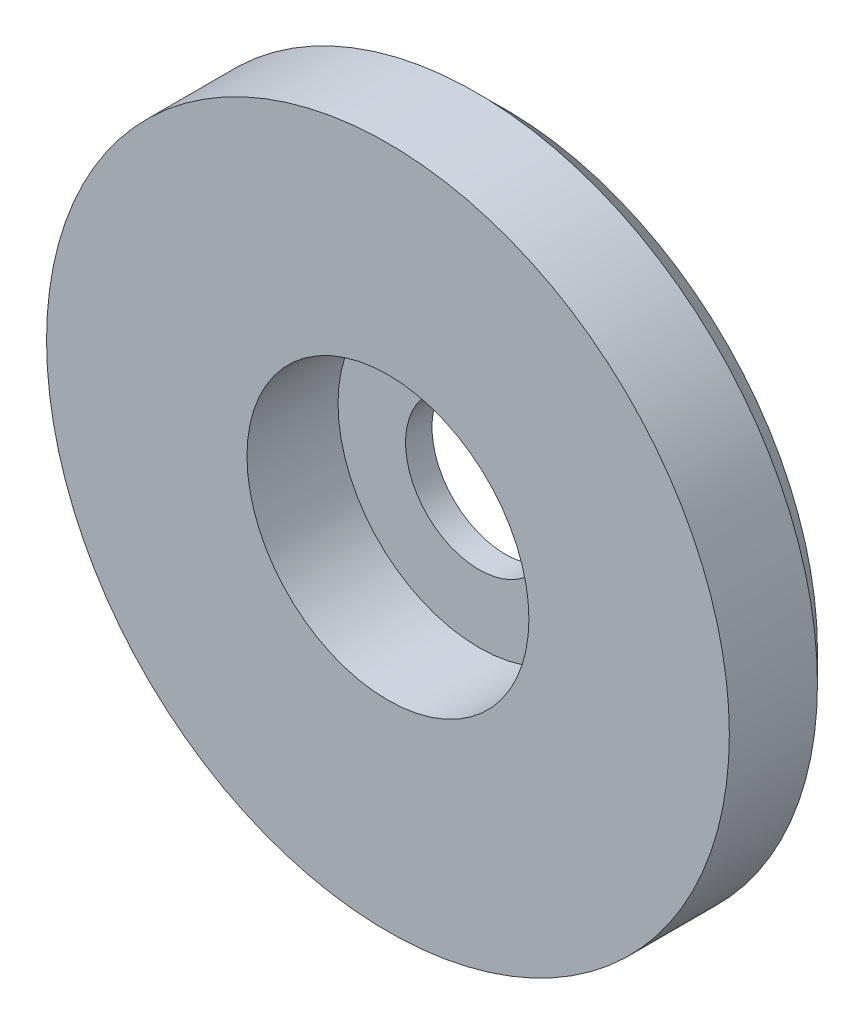
ISO-10303-21;
HEADER;
FILE_DESCRIPTION(('STEP AP214'),'2;1');
FILE_NAME('part.step','',(''),(''),'','','');
FILE_SCHEMA(('AUTOMOTIVE_DESIGN { 1 0 10303 214 1 1 1 1 }'));
ENDSEC;
DATA;
#1=APPLICATION_CONTEXT('core data for automotive mechanical design processes');
#2=APPLICATION_PROTOCOL_DEFINITION('international standard','automotive_design',2000,#1);
#3=PRODUCT_CONTEXT('',#1,'mechanical');
#4=PRODUCT('Part','Part','',(#3));
#5=PRODUCT_RELATED_PRODUCT_CATEGORY('part','',(#4));
#6=PRODUCT_DEFINITION_FORMATION('','',#4);
#7=PRODUCT_DEFINITION_CONTEXT('part definition',#1,'design');
#8=PRODUCT_DEFINITION('design','',#6,#7);
#9=PRODUCT_DEFINITION_SHAPE('','',#8);
#10=(LENGTH_UNIT() NAMED_UNIT(*) SI_UNIT(.MILLI.,.METRE.));
#11=(NAMED_UNIT(*) PLANE_ANGLE_UNIT() SI_UNIT($,.RADIAN.));
#12=(NAMED_UNIT(*) SI_UNIT($,.STERADIAN.) SOLID_ANGLE_UNIT());
#13=UNCERTAINTY_MEASURE_WITH_UNIT(LENGTH_MEASURE(1.E-05),#10,'distance_accuracy_value','');
#14=(GEOMETRIC_REPRESENTATION_CONTEXT(3) GLOBAL_UNCERTAINTY_ASSIGNED_CONTEXT((#13)) GLOBAL_UNIT_ASSIGNED_CONTEXT((#10,
#11,#12)) REPRESENTATION_CONTEXT('',''));
#15=CARTESIAN_POINT('',(0.,0.,0.));
#16=DIRECTION('',(0.,0.,1.));
#17=DIRECTION('',(1.,0.,0.));
#18=AXIS2_PLACEMENT_3D('',#15,#16,#17);
#19=CARTESIAN_POINT('',(0.,0.,8.));
#20=DIRECTION('',(0.,0.,-1.));
#21=DIRECTION('',(-1.,0.,0.));
#22=AXIS2_PLACEMENT_3D('',#19,#20,#21);
#23=CYLINDRICAL_SURFACE('',#22,23.25);
#24=CARTESIAN_POINT('',(0.,0.,2.00000000000001));
#25=DIRECTION('',(0.,0.,1.));
#26=DIRECTION('',(1.,0.,0.));
#27=AXIS2_PLACEMENT_3D('',#24,#25,#26);
#28=CIRCLE('',#27,23.25);
#29=CARTESIAN_POINT('',(23.25,0.,2.00000000000001));
#30=VERTEX_POINT('',#29);
#31=EDGE_CURVE('E38',#30,#30,#28,.T.);
#32=ORIENTED_EDGE('',*,*,#31,.T.);
#33=EDGE_LOOP('',(#32));
#34=FACE_BOUND('',#33,.T.);
#35=CARTESIAN_POINT('',(0.,0.,8.));
#36=DIRECTION('',(0.,0.,1.));
#37=DIRECTION('',(1.,0.,0.));
#38=AXIS2_PLACEMENT_3D('',#35,#36,#37);
#39=CIRCLE('',#38,23.25);
#40=CARTESIAN_POINT('',(23.25,0.,8.));
#41=VERTEX_POINT('',#40);
#42=EDGE_CURVE('E42',#41,#41,#39,.T.);
#43=ORIENTED_EDGE('',*,*,#42,.F.);
#44=EDGE_LOOP('',(#43));
#45=FACE_BOUND('',#44,.T.);
#46=ADVANCED_FACE('F31',(#34,#45),#23,.T.);
#47=CARTESIAN_POINT('',(0.,0.,8.));
#48=DIRECTION('',(0.,0.,1.));
#49=DIRECTION('',(1.,0.,0.));
#50=AXIS2_PLACEMENT_3D('',#47,#48,#49);
#51=PLANE('',#50);
#52=CARTESIAN_POINT('',(0.,0.,8.));
#53=DIRECTION('',(0.,0.,1.));
#54=DIRECTION('',(1.,0.,0.));
#55=AXIS2_PLACEMENT_3D('',#52,#53,#54);
#56=CIRCLE('',#55,9.6);
#57=CARTESIAN_POINT('',(9.6,0.,8.));
#58=VERTEX_POINT('',#57);
#59=EDGE_CURVE('E49',#58,#58,#56,.T.);
#60=ORIENTED_EDGE('',*,*,#59,.F.);
#61=EDGE_LOOP('',(#60));
#62=FACE_BOUND('',#61,.T.);
#63=ORIENTED_EDGE('',*,*,#42,.T.);
#64=EDGE_LOOP('',(#63));
#65=FACE_BOUND('',#64,.T.);
#66=ADVANCED_FACE('F76',(#62,#65),#51,.T.);
#67=CARTESIAN_POINT('',(0.,0.,0.));
#68=DIRECTION('',(0.,0.,1.));
#69=DIRECTION('',(1.,0.,0.));
#70=AXIS2_PLACEMENT_3D('',#67,#68,#69);
#71=PLANE('',#70);
#72=CARTESIAN_POINT('',(0.,0.,0.));
#73=DIRECTION('',(0.,0.,1.));
#74=DIRECTION('',(1.,0.,0.));
#75=AXIS2_PLACEMENT_3D('',#72,#73,#74);
#76=CIRCLE('',#75,21.25);
#77=CARTESIAN_POINT('',(21.25,0.,0.));
#78=VERTEX_POINT('',#77);
#79=EDGE_CURVE('E10',#78,#78,#76,.F.);
#80=ORIENTED_EDGE('',*,*,#79,.T.);
#81=EDGE_LOOP('',(#80));
#82=FACE_BOUND('',#81,.T.);
#83=CARTESIAN_POINT('',(0.,0.,0.));
#84=DIRECTION('',(0.,0.,1.));
#85=DIRECTION('',(1.,0.,0.));
#86=AXIS2_PLACEMENT_3D('',#83,#84,#85);
#87=CIRCLE('',#86,5.);
#88=CARTESIAN_POINT('',(5.,0.,0.));
#89=VERTEX_POINT('',#88);
#90=EDGE_CURVE('E52',#89,#89,#87,.F.);
#91=ORIENTED_EDGE('',*,*,#90,.F.);
#92=EDGE_LOOP('',(#91));
#93=FACE_BOUND('',#92,.T.);
#94=ADVANCED_FACE('F72',(#82,#93),#71,.F.);
#95=CARTESIAN_POINT('',(0.,0.,1.8));
#96=DIRECTION('',(0.,0.,1.));
#97=DIRECTION('',(1.,0.,0.));
#98=AXIS2_PLACEMENT_3D('',#95,#96,#97);
#99=CYLINDRICAL_SURFACE('',#98,9.6);
#100=CARTESIAN_POINT('',(0.,0.,1.8));
#101=DIRECTION('',(0.,0.,1.));
#102=DIRECTION('',(1.,0.,0.));
#103=AXIS2_PLACEMENT_3D('',#100,#101,#102);
#104=CIRCLE('',#103,9.6);
#105=CARTESIAN_POINT('',(9.6,0.,1.8));
#106=VERTEX_POINT('',#105);
#107=EDGE_CURVE('E46',#106,#106,#104,.T.);
#108=CARTESIAN_POINT('',(9.6,0.,1.8));
#109=CARTESIAN_POINT('',(9.6,0.,1.86458333333333));
#110=CARTESIAN_POINT('',(9.6,0.,1.92916666666667));
#111=CARTESIAN_POINT('',(9.6,0.,2.05833333333333));
#112=CARTESIAN_POINT('',(9.6,0.,2.12291666666667));
#113=CARTESIAN_POINT('',(9.6,0.,2.25208333333333));
#114=CARTESIAN_POINT('',(9.6,0.,2.31666666666667));
#115=CARTESIAN_POINT('',(9.6,0.,2.44583333333333));
#116=CARTESIAN_POINT('',(9.6,0.,2.51041666666667));
#117=CARTESIAN_POINT('',(9.6,0.,2.63958333333333));
#118=CARTESIAN_POINT('',(9.6,0.,2.70416666666667));
#119=CARTESIAN_POINT('',(9.6,0.,2.83333333333333));
#120=CARTESIAN_POINT('',(9.6,0.,2.89791666666667));
#121=CARTESIAN_POINT('',(9.6,0.,3.02708333333333));
#122=CARTESIAN_POINT('',(9.6,0.,3.09166666666667));
#123=CARTESIAN_POINT('',(9.6,0.,3.22083333333333));
#124=CARTESIAN_POINT('',(9.6,0.,3.28541666666667));
#125=CARTESIAN_POINT('',(9.6,0.,3.41458333333333));
#126=CARTESIAN_POINT('',(9.6,0.,3.47916666666667));
#127=CARTESIAN_POINT('',(9.6,0.,3.60833333333333));
#128=CARTESIAN_POINT('',(9.6,0.,3.67291666666667));
#129=CARTESIAN_POINT('',(9.6,0.,3.80208333333333));
#130=CARTESIAN_POINT('',(9.6,0.,3.86666666666667));
#131=CARTESIAN_POINT('',(9.6,0.,3.99583333333333));
#132=CARTESIAN_POINT('',(9.6,0.,4.06041666666667));
#133=CARTESIAN_POINT('',(9.6,0.,4.18958333333333));
#134=CARTESIAN_POINT('',(9.6,0.,4.25416666666667));
#135=CARTESIAN_POINT('',(9.6,0.,4.38333333333333));
#136=CARTESIAN_POINT('',(9.6,0.,4.44791666666667));
#137=CARTESIAN_POINT('',(9.6,0.,4.57708333333333));
#138=CARTESIAN_POINT('',(9.6,0.,4.64166666666667));
#139=CARTESIAN_POINT('',(9.6,0.,4.77083333333333));
#140=CARTESIAN_POINT('',(9.6,0.,4.83541666666667));
#141=CARTESIAN_POINT('',(9.6,0.,4.96458333333333));
#142=CARTESIAN_POINT('',(9.6,0.,5.02916666666667));
#143=CARTESIAN_POINT('',(9.6,0.,5.15833333333333));
#144=CARTESIAN_POINT('',(9.6,0.,5.22291666666667));
#145=CARTESIAN_POINT('',(9.6,0.,5.35208333333333));
#146=CARTESIAN_POINT('',(9.6,0.,5.41666666666667));
#147=CARTESIAN_POINT('',(9.6,0.,5.54583333333333));
#148=CARTESIAN_POINT('',(9.6,0.,5.61041666666667));
#149=CARTESIAN_POINT('',(9.6,0.,5.73958333333333));
#150=CARTESIAN_POINT('',(9.6,0.,5.80416666666667));
#151=CARTESIAN_POINT('',(9.6,0.,5.93333333333333));
#152=CARTESIAN_POINT('',(9.6,0.,5.99791666666667));
#153=CARTESIAN_POINT('',(9.6,0.,6.12708333333333));
#154=CARTESIAN_POINT('',(9.6,0.,6.19166666666667));
#155=CARTESIAN_POINT('',(9.6,0.,6.32083333333333));
#156=CARTESIAN_POINT('',(9.6,0.,6.38541666666667));
#157=CARTESIAN_POINT('',(9.6,0.,6.51458333333333));
#158=CARTESIAN_POINT('',(9.6,0.,6.57916666666667));
#159=CARTESIAN_POINT('',(9.6,0.,6.70833333333333));
#160=CARTESIAN_POINT('',(9.6,0.,6.77291666666667));
#161=CARTESIAN_POINT('',(9.6,0.,6.90208333333333));
#162=CARTESIAN_POINT('',(9.6,0.,6.96666666666667));
#163=CARTESIAN_POINT('',(9.6,0.,7.09583333333333));
#164=CARTESIAN_POINT('',(9.6,0.,7.16041666666667));
#165=CARTESIAN_POINT('',(9.6,0.,7.28958333333333));
#166=CARTESIAN_POINT('',(9.6,0.,7.35416666666667));
#167=CARTESIAN_POINT('',(9.6,0.,7.48333333333333));
#168=CARTESIAN_POINT('',(9.6,0.,7.54791666666667));
#169=CARTESIAN_POINT('',(9.6,0.,7.67708333333333));
#170=CARTESIAN_POINT('',(9.6,0.,7.74166666666667));
#171=CARTESIAN_POINT('',(9.6,0.,7.87083333333333));
#172=CARTESIAN_POINT('',(9.6,0.,7.93541666666667));
#173=CARTESIAN_POINT('',(9.6,0.,8.));
#174=B_SPLINE_CURVE_WITH_KNOTS('',3,(#108,#109,#110,#111,#112,#113,#114,#115,#116,#117,#118,
#119,#120,#121,#122,#123,#124,#125,#126,#127,#128,#129,#130,#131,#132,#133,#134,#135,#136,#137,
#138,#139,#140,#141,#142,#143,#144,#145,#146,#147,#148,#149,#150,#151,#152,#153,#154,#155,#156,
#157,#158,#159,#160,#161,#162,#163,#164,#165,#166,#167,#168,#169,#170,#171,#172,#173),
.UNSPECIFIED.,.F.,.F.,(4,2,2,2,2,2,2,2,2,2,2,2,2,2,2,2,2,2,2,2,2,2,2,2,2,2,2,2,2,2,2,2,4),(0.,
0.19375,0.3875,0.58125,0.775,0.96875,1.1625,1.35625,1.55,1.74375,1.9375,2.13125,2.325,2.51875,
2.7125,2.90625,3.1,3.29375,3.4875,3.68125,3.875,4.06875,4.2625,4.45625,4.65,4.84375,5.0375,
5.23125,5.425,5.61875,5.8125,6.00625,6.2),.UNSPECIFIED.);
#175=EDGE_CURVE('BSEAM66',#106,#58,#174,.T.);
#176=ORIENTED_EDGE('',*,*,#107,.F.);
#177=ORIENTED_EDGE('',*,*,#59,.T.);
#178=ORIENTED_EDGE('',*,*,#175,.T.);
#179=ORIENTED_EDGE('',*,*,#175,.F.);
#180=EDGE_LOOP('',(#176,#178,#177,#179));
#181=FACE_BOUND('',#180,.T.);
#182=ADVANCED_FACE('F66',(#181),#99,.F.);
#183=CARTESIAN_POINT('',(0.,0.,1.8));
#184=DIRECTION('',(0.,0.,1.));
#185=DIRECTION('',(1.,0.,0.));
#186=AXIS2_PLACEMENT_3D('',#183,#184,#185);
#187=PLANE('',#186);
#188=CARTESIAN_POINT('',(0.,0.,1.8));
#189=DIRECTION('',(0.,0.,1.));
#190=DIRECTION('',(1.,0.,0.));
#191=AXIS2_PLACEMENT_3D('',#188,#189,#190);
#192=CIRCLE('',#191,5.);
#193=CARTESIAN_POINT('',(5.,0.,1.8));
#194=VERTEX_POINT('',#193);
#195=EDGE_CURVE('E57',#194,#194,#192,.T.);
#196=ORIENTED_EDGE('',*,*,#195,.F.);
#197=EDGE_LOOP('',(#196));
#198=FACE_BOUND('',#197,.T.);
#199=ORIENTED_EDGE('',*,*,#107,.T.);
#200=EDGE_LOOP('',(#199));
#201=FACE_BOUND('',#200,.T.);
#202=ADVANCED_FACE('F63',(#198,#201),#187,.T.);
#203=CARTESIAN_POINT('',(0.,0.,-14.142135623731));
#204=DIRECTION('',(0.,0.,1.));
#205=DIRECTION('',(1.,0.,0.));
#206=AXIS2_PLACEMENT_3D('',#203,#204,#205);
#207=CYLINDRICAL_SURFACE('',#206,5.);
#208=ORIENTED_EDGE('',*,*,#90,.T.);
#209=EDGE_LOOP('',(#208));
#210=FACE_BOUND('',#209,.T.);
#211=ORIENTED_EDGE('',*,*,#195,.T.);
#212=EDGE_LOOP('',(#211));
#213=FACE_BOUND('',#212,.T.);
#214=ADVANCED_FACE('F61',(#210,#213),#207,.F.);
#215=CARTESIAN_POINT('',(0.,0.,2.00000000000001));
#216=DIRECTION('',(0.,0.,1.));
#217=DIRECTION('',(1.,0.,0.));
#218=AXIS2_PLACEMENT_3D('',#215,#216,#217);
#219=CONICAL_SURFACE('',#218,23.25,0.785398163397451);
#220=ORIENTED_EDGE('',*,*,#79,.F.);
#221=EDGE_LOOP('',(#220));
#222=FACE_BOUND('',#221,.T.);
#223=ORIENTED_EDGE('',*,*,#31,.F.);
#224=EDGE_LOOP('',(#223));
#225=FACE_BOUND('',#224,.T.);
#226=ADVANCED_FACE('F33',(#222,#225),#219,.T.);
#227=CLOSED_SHELL('',(#46,#66,#94,#182,#202,#214,#226));
#228=MANIFOLD_SOLID_BREP('B2',#227);
#229=ADVANCED_BREP_SHAPE_REPRESENTATION('',(#18,#228),#14);
#230=SHAPE_DEFINITION_REPRESENTATION(#9,#229);
ENDSEC;
END-ISO-10303-21;
